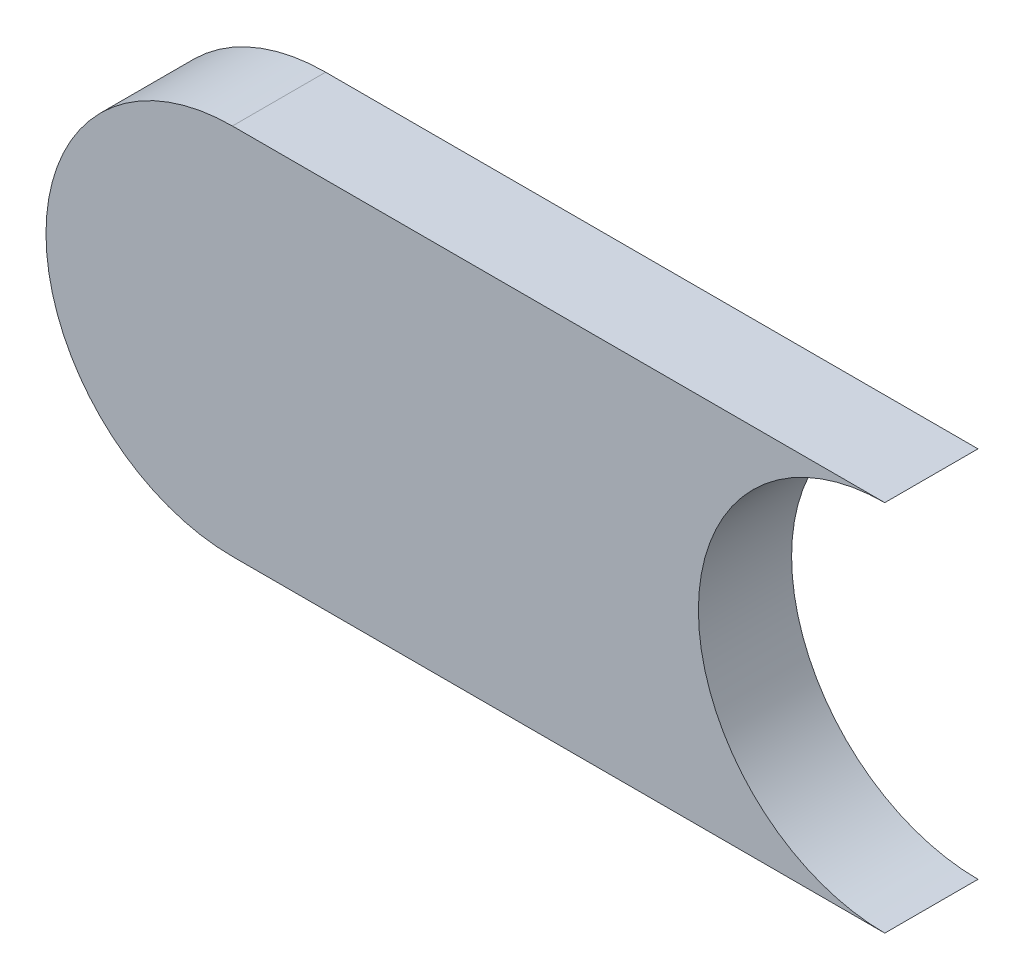
ISO-10303-21;
HEADER;
FILE_DESCRIPTION(('STEP AP214'),'2;1');
FILE_NAME('part.step','',(''),(''),'','','');
FILE_SCHEMA(('AUTOMOTIVE_DESIGN { 1 0 10303 214 1 1 1 1 }'));
ENDSEC;
DATA;
#1=APPLICATION_CONTEXT('core data for automotive mechanical design processes');
#2=APPLICATION_PROTOCOL_DEFINITION('international standard','automotive_design',2000,#1);
#3=PRODUCT_CONTEXT('',#1,'mechanical');
#4=PRODUCT('Part','Part','',(#3));
#5=PRODUCT_RELATED_PRODUCT_CATEGORY('part','',(#4));
#6=PRODUCT_DEFINITION_FORMATION('','',#4);
#7=PRODUCT_DEFINITION_CONTEXT('part definition',#1,'design');
#8=PRODUCT_DEFINITION('design','',#6,#7);
#9=PRODUCT_DEFINITION_SHAPE('','',#8);
#10=(LENGTH_UNIT() NAMED_UNIT(*) SI_UNIT(.MILLI.,.METRE.));
#11=(NAMED_UNIT(*) PLANE_ANGLE_UNIT() SI_UNIT($,.RADIAN.));
#12=(NAMED_UNIT(*) SI_UNIT($,.STERADIAN.) SOLID_ANGLE_UNIT());
#13=UNCERTAINTY_MEASURE_WITH_UNIT(LENGTH_MEASURE(1.E-05),#10,'distance_accuracy_value','');
#14=(GEOMETRIC_REPRESENTATION_CONTEXT(3) GLOBAL_UNCERTAINTY_ASSIGNED_CONTEXT((#13)) GLOBAL_UNIT_ASSIGNED_CONTEXT((#10,
#11,#12)) REPRESENTATION_CONTEXT('',''));
#15=CARTESIAN_POINT('',(0.,0.,0.));
#16=DIRECTION('',(0.,0.,1.));
#17=DIRECTION('',(1.,0.,0.));
#18=AXIS2_PLACEMENT_3D('',#15,#16,#17);
#19=CARTESIAN_POINT('',(0.,25.4,12.7));
#20=DIRECTION('',(0.,0.,-1.));
#21=DIRECTION('',(-1.,0.,0.));
#22=AXIS2_PLACEMENT_3D('',#19,#20,#21);
#23=CYLINDRICAL_SURFACE('',#22,25.4);
#24=CARTESIAN_POINT('',(0.,25.4,0.));
#25=DIRECTION('',(0.,0.,1.));
#26=DIRECTION('',(1.,0.,0.));
#27=AXIS2_PLACEMENT_3D('',#24,#25,#26);
#28=CIRCLE('',#27,25.4);
#29=CARTESIAN_POINT('',(0.,50.8,0.));
#30=VERTEX_POINT('',#29);
#31=CARTESIAN_POINT('',(0.,0.,0.));
#32=VERTEX_POINT('',#31);
#33=EDGE_CURVE('E107',#30,#32,#28,.T.);
#34=ORIENTED_EDGE('',*,*,#33,.T.);
#35=DIRECTION('',(0.,0.,-1.));
#36=VECTOR('',#35,1.);
#37=CARTESIAN_POINT('',(0.,0.,12.7));
#38=LINE('',#37,#36);
#39=CARTESIAN_POINT('',(0.,0.,12.7));
#40=VERTEX_POINT('',#39);
#41=EDGE_CURVE('E11',#40,#32,#38,.T.);
#42=ORIENTED_EDGE('',*,*,#41,.F.);
#43=CARTESIAN_POINT('',(0.,25.4,12.7));
#44=DIRECTION('',(0.,0.,1.));
#45=DIRECTION('',(1.,0.,0.));
#46=AXIS2_PLACEMENT_3D('',#43,#44,#45);
#47=CIRCLE('',#46,25.4);
#48=CARTESIAN_POINT('',(0.,50.8,12.7));
#49=VERTEX_POINT('',#48);
#50=EDGE_CURVE('E91',#49,#40,#47,.T.);
#51=ORIENTED_EDGE('',*,*,#50,.F.);
#52=DIRECTION('',(0.,0.,-1.));
#53=VECTOR('',#52,1.);
#54=CARTESIAN_POINT('',(0.,50.8,12.7));
#55=LINE('',#54,#53);
#56=EDGE_CURVE('E103',#49,#30,#55,.T.);
#57=ORIENTED_EDGE('',*,*,#56,.T.);
#58=EDGE_LOOP('',(#34,#42,#51,#57));
#59=FACE_BOUND('',#58,.T.);
#60=ADVANCED_FACE('F39',(#59),#23,.T.);
#61=CARTESIAN_POINT('',(0.,0.,12.7));
#62=DIRECTION('',(0.,1.,0.));
#63=DIRECTION('',(0.,0.,1.));
#64=AXIS2_PLACEMENT_3D('',#61,#62,#63);
#65=PLANE('',#64);
#66=DIRECTION('',(1.,0.,0.));
#67=VECTOR('',#66,1.);
#68=CARTESIAN_POINT('',(0.,0.,0.));
#69=LINE('',#68,#67);
#70=CARTESIAN_POINT('',(88.9,0.,0.));
#71=VERTEX_POINT('',#70);
#72=EDGE_CURVE('E96',#32,#71,#69,.T.);
#73=ORIENTED_EDGE('',*,*,#72,.T.);
#74=DIRECTION('',(0.,0.,-1.));
#75=VECTOR('',#74,1.);
#76=CARTESIAN_POINT('',(88.9,0.,12.7));
#77=LINE('',#76,#75);
#78=CARTESIAN_POINT('',(88.9,0.,12.7));
#79=VERTEX_POINT('',#78);
#80=EDGE_CURVE('E48',#79,#71,#77,.T.);
#81=ORIENTED_EDGE('',*,*,#80,.F.);
#82=DIRECTION('',(1.,0.,0.));
#83=VECTOR('',#82,1.);
#84=CARTESIAN_POINT('',(0.,0.,12.7));
#85=LINE('',#84,#83);
#86=EDGE_CURVE('E86',#40,#79,#85,.T.);
#87=ORIENTED_EDGE('',*,*,#86,.F.);
#88=ORIENTED_EDGE('',*,*,#41,.T.);
#89=EDGE_LOOP('',(#73,#81,#87,#88));
#90=FACE_BOUND('',#89,.T.);
#91=ADVANCED_FACE('F95',(#90),#65,.F.);
#92=CARTESIAN_POINT('',(88.9,25.4,12.7));
#93=DIRECTION('',(0.,0.,-1.));
#94=DIRECTION('',(-1.,0.,0.));
#95=AXIS2_PLACEMENT_3D('',#92,#93,#94);
#96=CYLINDRICAL_SURFACE('',#95,25.4);
#97=CARTESIAN_POINT('',(88.9,25.4,0.));
#98=DIRECTION('',(0.,0.,-1.));
#99=DIRECTION('',(-1.,0.,0.));
#100=AXIS2_PLACEMENT_3D('',#97,#98,#99);
#101=CIRCLE('',#100,25.4);
#102=CARTESIAN_POINT('',(88.9,50.8,0.));
#103=VERTEX_POINT('',#102);
#104=EDGE_CURVE('E73',#71,#103,#101,.T.);
#105=ORIENTED_EDGE('',*,*,#104,.T.);
#106=DIRECTION('',(0.,0.,-1.));
#107=VECTOR('',#106,1.);
#108=CARTESIAN_POINT('',(88.9,50.8,12.7));
#109=LINE('',#108,#107);
#110=CARTESIAN_POINT('',(88.9,50.8,12.7));
#111=VERTEX_POINT('',#110);
#112=EDGE_CURVE('E98',#111,#103,#109,.T.);
#113=ORIENTED_EDGE('',*,*,#112,.F.);
#114=CARTESIAN_POINT('',(88.9,25.4,12.7));
#115=DIRECTION('',(0.,0.,-1.));
#116=DIRECTION('',(-1.,0.,0.));
#117=AXIS2_PLACEMENT_3D('',#114,#115,#116);
#118=CIRCLE('',#117,25.4);
#119=EDGE_CURVE('E89',#79,#111,#118,.T.);
#120=ORIENTED_EDGE('',*,*,#119,.F.);
#121=ORIENTED_EDGE('',*,*,#80,.T.);
#122=EDGE_LOOP('',(#105,#113,#120,#121));
#123=FACE_BOUND('',#122,.T.);
#124=ADVANCED_FACE('F99',(#123),#96,.F.);
#125=CARTESIAN_POINT('',(0.,50.8,12.7));
#126=DIRECTION('',(0.,-1.,0.));
#127=DIRECTION('',(0.,0.,-1.));
#128=AXIS2_PLACEMENT_3D('',#125,#126,#127);
#129=PLANE('',#128);
#130=DIRECTION('',(-1.,0.,0.));
#131=VECTOR('',#130,1.);
#132=CARTESIAN_POINT('',(0.,50.8,0.));
#133=LINE('',#132,#131);
#134=EDGE_CURVE('E79',#103,#30,#133,.T.);
#135=ORIENTED_EDGE('',*,*,#134,.T.);
#136=ORIENTED_EDGE('',*,*,#56,.F.);
#137=DIRECTION('',(-1.,0.,0.));
#138=VECTOR('',#137,1.);
#139=CARTESIAN_POINT('',(0.,50.8,12.7));
#140=LINE('',#139,#138);
#141=EDGE_CURVE('E56',#111,#49,#140,.T.);
#142=ORIENTED_EDGE('',*,*,#141,.F.);
#143=ORIENTED_EDGE('',*,*,#112,.T.);
#144=EDGE_LOOP('',(#135,#136,#142,#143));
#145=FACE_BOUND('',#144,.T.);
#146=ADVANCED_FACE('F120',(#145),#129,.F.);
#147=CARTESIAN_POINT('',(0.,25.4,12.7));
#148=DIRECTION('',(0.,0.,1.));
#149=DIRECTION('',(1.,0.,0.));
#150=AXIS2_PLACEMENT_3D('',#147,#148,#149);
#151=PLANE('',#150);
#152=ORIENTED_EDGE('',*,*,#50,.T.);
#153=ORIENTED_EDGE('',*,*,#86,.T.);
#154=ORIENTED_EDGE('',*,*,#119,.T.);
#155=ORIENTED_EDGE('',*,*,#141,.T.);
#156=EDGE_LOOP('',(#152,#153,#154,#155));
#157=FACE_BOUND('',#156,.T.);
#158=ADVANCED_FACE('F87',(#157),#151,.T.);
#159=CARTESIAN_POINT('',(0.,25.4,0.));
#160=DIRECTION('',(0.,0.,1.));
#161=DIRECTION('',(1.,0.,0.));
#162=AXIS2_PLACEMENT_3D('',#159,#160,#161);
#163=PLANE('',#162);
#164=ORIENTED_EDGE('',*,*,#33,.F.);
#165=ORIENTED_EDGE('',*,*,#134,.F.);
#166=ORIENTED_EDGE('',*,*,#104,.F.);
#167=ORIENTED_EDGE('',*,*,#72,.F.);
#168=EDGE_LOOP('',(#164,#165,#166,#167));
#169=FACE_BOUND('',#168,.T.);
#170=ADVANCED_FACE('F123',(#169),#163,.F.);
#171=CLOSED_SHELL('',(#60,#91,#124,#146,#158,#170));
#172=MANIFOLD_SOLID_BREP('B2',#171);
#173=ADVANCED_BREP_SHAPE_REPRESENTATION('',(#18,#172),#14);
#174=SHAPE_DEFINITION_REPRESENTATION(#9,#173);
ENDSEC;
END-ISO-10303-21;
